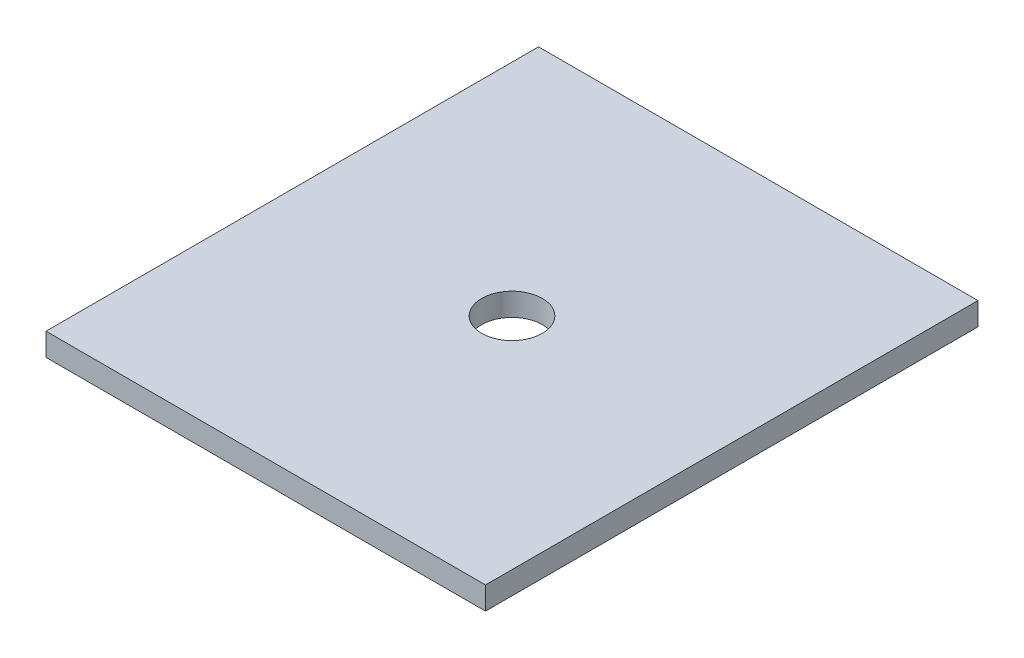
ISO-10303-21;
HEADER;
FILE_DESCRIPTION(('STEP AP214'),'2;1');
FILE_NAME('part.step','',(''),(''),'','','');
FILE_SCHEMA(('AUTOMOTIVE_DESIGN { 1 0 10303 214 1 1 1 1 }'));
ENDSEC;
DATA;
#1=APPLICATION_CONTEXT('core data for automotive mechanical design processes');
#2=APPLICATION_PROTOCOL_DEFINITION('international standard','automotive_design',2000,#1);
#3=PRODUCT_CONTEXT('',#1,'mechanical');
#4=PRODUCT('Part','Part','',(#3));
#5=PRODUCT_RELATED_PRODUCT_CATEGORY('part','',(#4));
#6=PRODUCT_DEFINITION_FORMATION('','',#4);
#7=PRODUCT_DEFINITION_CONTEXT('part definition',#1,'design');
#8=PRODUCT_DEFINITION('design','',#6,#7);
#9=PRODUCT_DEFINITION_SHAPE('','',#8);
#10=(LENGTH_UNIT() NAMED_UNIT(*) SI_UNIT(.MILLI.,.METRE.));
#11=(NAMED_UNIT(*) PLANE_ANGLE_UNIT() SI_UNIT($,.RADIAN.));
#12=(NAMED_UNIT(*) SI_UNIT($,.STERADIAN.) SOLID_ANGLE_UNIT());
#13=UNCERTAINTY_MEASURE_WITH_UNIT(LENGTH_MEASURE(1.E-05),#10,'distance_accuracy_value','');
#14=(GEOMETRIC_REPRESENTATION_CONTEXT(3) GLOBAL_UNCERTAINTY_ASSIGNED_CONTEXT((#13)) GLOBAL_UNIT_ASSIGNED_CONTEXT((#10,
#11,#12)) REPRESENTATION_CONTEXT('',''));
#15=CARTESIAN_POINT('',(0.,0.,0.));
#16=DIRECTION('',(0.,0.,1.));
#17=DIRECTION('',(1.,0.,0.));
#18=AXIS2_PLACEMENT_3D('',#15,#16,#17);
#19=CARTESIAN_POINT('',(0.,3.,0.));
#20=DIRECTION('',(0.,-1.,0.));
#21=DIRECTION('',(0.,0.,-1.));
#22=AXIS2_PLACEMENT_3D('',#19,#20,#21);
#23=PLANE('',#22);
#24=DIRECTION('',(0.,0.,-1.));
#25=VECTOR('',#24,1.);
#26=CARTESIAN_POINT('',(28.9999561114016,3.,-32.5));
#27=LINE('',#26,#25);
#28=CARTESIAN_POINT('',(28.9999561114016,3.,32.4999508145017));
#29=VERTEX_POINT('',#28);
#30=CARTESIAN_POINT('',(28.9999561114016,3.,-32.5));
#31=VERTEX_POINT('',#30);
#32=EDGE_CURVE('E92',#29,#31,#27,.T.);
#33=ORIENTED_EDGE('',*,*,#32,.T.);
#34=DIRECTION('',(-1.,0.,0.));
#35=VECTOR('',#34,1.);
#36=CARTESIAN_POINT('',(-29.,3.,-32.5));
#37=LINE('',#36,#35);
#38=CARTESIAN_POINT('',(-29.,3.,-32.5));
#39=VERTEX_POINT('',#38);
#40=EDGE_CURVE('E87',#31,#39,#37,.T.);
#41=ORIENTED_EDGE('',*,*,#40,.T.);
#42=DIRECTION('',(0.,0.,1.));
#43=VECTOR('',#42,1.);
#44=CARTESIAN_POINT('',(-29.,3.,32.4999508145017));
#45=LINE('',#44,#43);
#46=CARTESIAN_POINT('',(-29.,3.,32.4999508145017));
#47=VERTEX_POINT('',#46);
#48=EDGE_CURVE('E90',#39,#47,#45,.T.);
#49=ORIENTED_EDGE('',*,*,#48,.T.);
#50=DIRECTION('',(1.,0.,0.));
#51=VECTOR('',#50,1.);
#52=CARTESIAN_POINT('',(28.9999561114016,3.,32.4999508145017));
#53=LINE('',#52,#51);
#54=EDGE_CURVE('E57',#47,#29,#53,.T.);
#55=ORIENTED_EDGE('',*,*,#54,.T.);
#56=EDGE_LOOP('',(#33,#41,#49,#55));
#57=FACE_BOUND('',#56,.T.);
#58=CARTESIAN_POINT('',(0.,3.,0.));
#59=DIRECTION('',(0.,1.,0.));
#60=DIRECTION('',(0.,0.,1.));
#61=AXIS2_PLACEMENT_3D('',#58,#59,#60);
#62=CIRCLE('',#61,4.00000000000003);
#63=CARTESIAN_POINT('',(0.,3.,4.00000000000003));
#64=VERTEX_POINT('',#63);
#65=EDGE_CURVE('E107',#64,#64,#62,.T.);
#66=ORIENTED_EDGE('',*,*,#65,.F.);
#67=EDGE_LOOP('',(#66));
#68=FACE_BOUND('',#67,.T.);
#69=ADVANCED_FACE('F40',(#57,#68),#23,.F.);
#70=CARTESIAN_POINT('',(0.,0.,0.));
#71=DIRECTION('',(0.,-1.,0.));
#72=DIRECTION('',(0.,0.,-1.));
#73=AXIS2_PLACEMENT_3D('',#70,#71,#72);
#74=PLANE('',#73);
#75=DIRECTION('',(0.,0.,-1.));
#76=VECTOR('',#75,1.);
#77=CARTESIAN_POINT('',(28.9999561114016,0.,-32.5));
#78=LINE('',#77,#76);
#79=CARTESIAN_POINT('',(28.9999561114016,0.,32.4999508145017));
#80=VERTEX_POINT('',#79);
#81=CARTESIAN_POINT('',(28.9999561114016,0.,-32.5));
#82=VERTEX_POINT('',#81);
#83=EDGE_CURVE('E104',#80,#82,#78,.T.);
#84=ORIENTED_EDGE('',*,*,#83,.F.);
#85=DIRECTION('',(1.,0.,0.));
#86=VECTOR('',#85,1.);
#87=CARTESIAN_POINT('',(28.9999561114016,0.,32.4999508145017));
#88=LINE('',#87,#86);
#89=CARTESIAN_POINT('',(-29.,0.,32.4999508145017));
#90=VERTEX_POINT('',#89);
#91=EDGE_CURVE('E80',#90,#80,#88,.T.);
#92=ORIENTED_EDGE('',*,*,#91,.F.);
#93=DIRECTION('',(0.,0.,1.));
#94=VECTOR('',#93,1.);
#95=CARTESIAN_POINT('',(-29.,0.,32.4999508145017));
#96=LINE('',#95,#94);
#97=CARTESIAN_POINT('',(-29.,0.,-32.5));
#98=VERTEX_POINT('',#97);
#99=EDGE_CURVE('E74',#98,#90,#96,.T.);
#100=ORIENTED_EDGE('',*,*,#99,.F.);
#101=DIRECTION('',(-1.,0.,0.));
#102=VECTOR('',#101,1.);
#103=CARTESIAN_POINT('',(-29.,0.,-32.5));
#104=LINE('',#103,#102);
#105=EDGE_CURVE('E96',#82,#98,#104,.T.);
#106=ORIENTED_EDGE('',*,*,#105,.F.);
#107=EDGE_LOOP('',(#84,#92,#100,#106));
#108=FACE_BOUND('',#107,.T.);
#109=CARTESIAN_POINT('',(0.,0.,0.));
#110=DIRECTION('',(0.,1.,0.));
#111=DIRECTION('',(0.,0.,1.));
#112=AXIS2_PLACEMENT_3D('',#109,#110,#111);
#113=CIRCLE('',#112,4.00000000000003);
#114=CARTESIAN_POINT('',(0.,0.,4.00000000000003));
#115=VERTEX_POINT('',#114);
#116=EDGE_CURVE('E119',#115,#115,#113,.T.);
#117=ORIENTED_EDGE('',*,*,#116,.T.);
#118=EDGE_LOOP('',(#117));
#119=FACE_BOUND('',#118,.T.);
#120=ADVANCED_FACE('F115',(#108,#119),#74,.T.);
#121=CARTESIAN_POINT('',(28.9999561114016,3.,-32.5));
#122=DIRECTION('',(-1.,0.,0.));
#123=DIRECTION('',(0.,0.,1.));
#124=AXIS2_PLACEMENT_3D('',#121,#122,#123);
#125=PLANE('',#124);
#126=ORIENTED_EDGE('',*,*,#83,.T.);
#127=DIRECTION('',(0.,-1.,0.));
#128=VECTOR('',#127,1.);
#129=CARTESIAN_POINT('',(28.9999561114016,3.,-32.5));
#130=LINE('',#129,#128);
#131=EDGE_CURVE('E11',#31,#82,#130,.T.);
#132=ORIENTED_EDGE('',*,*,#131,.F.);
#133=ORIENTED_EDGE('',*,*,#32,.F.);
#134=DIRECTION('',(0.,-1.,0.));
#135=VECTOR('',#134,1.);
#136=CARTESIAN_POINT('',(28.9999561114016,3.,32.4999508145017));
#137=LINE('',#136,#135);
#138=EDGE_CURVE('E100',#29,#80,#137,.T.);
#139=ORIENTED_EDGE('',*,*,#138,.T.);
#140=EDGE_LOOP('',(#126,#132,#133,#139));
#141=FACE_BOUND('',#140,.T.);
#142=ADVANCED_FACE('F42',(#141),#125,.F.);
#143=CARTESIAN_POINT('',(-29.,3.,-32.5));
#144=DIRECTION('',(0.,0.,1.));
#145=DIRECTION('',(1.,0.,0.));
#146=AXIS2_PLACEMENT_3D('',#143,#144,#145);
#147=PLANE('',#146);
#148=ORIENTED_EDGE('',*,*,#105,.T.);
#149=DIRECTION('',(0.,-1.,0.));
#150=VECTOR('',#149,1.);
#151=CARTESIAN_POINT('',(-29.,3.,-32.5));
#152=LINE('',#151,#150);
#153=EDGE_CURVE('E49',#39,#98,#152,.T.);
#154=ORIENTED_EDGE('',*,*,#153,.F.);
#155=ORIENTED_EDGE('',*,*,#40,.F.);
#156=ORIENTED_EDGE('',*,*,#131,.T.);
#157=EDGE_LOOP('',(#148,#154,#155,#156));
#158=FACE_BOUND('',#157,.T.);
#159=ADVANCED_FACE('F95',(#158),#147,.F.);
#160=CARTESIAN_POINT('',(-29.,3.,32.4999508145017));
#161=DIRECTION('',(1.,0.,0.));
#162=DIRECTION('',(0.,0.,-1.));
#163=AXIS2_PLACEMENT_3D('',#160,#161,#162);
#164=PLANE('',#163);
#165=ORIENTED_EDGE('',*,*,#99,.T.);
#166=DIRECTION('',(0.,-1.,0.));
#167=VECTOR('',#166,1.);
#168=CARTESIAN_POINT('',(-29.,3.,32.4999508145017));
#169=LINE('',#168,#167);
#170=EDGE_CURVE('E97',#47,#90,#169,.T.);
#171=ORIENTED_EDGE('',*,*,#170,.F.);
#172=ORIENTED_EDGE('',*,*,#48,.F.);
#173=ORIENTED_EDGE('',*,*,#153,.T.);
#174=EDGE_LOOP('',(#165,#171,#172,#173));
#175=FACE_BOUND('',#174,.T.);
#176=ADVANCED_FACE('F98',(#175),#164,.F.);
#177=CARTESIAN_POINT('',(28.9999561114016,3.,32.4999508145017));
#178=DIRECTION('',(0.,0.,-1.));
#179=DIRECTION('',(-1.,0.,0.));
#180=AXIS2_PLACEMENT_3D('',#177,#178,#179);
#181=PLANE('',#180);
#182=ORIENTED_EDGE('',*,*,#91,.T.);
#183=ORIENTED_EDGE('',*,*,#138,.F.);
#184=ORIENTED_EDGE('',*,*,#54,.F.);
#185=ORIENTED_EDGE('',*,*,#170,.T.);
#186=EDGE_LOOP('',(#182,#183,#184,#185));
#187=FACE_BOUND('',#186,.T.);
#188=ADVANCED_FACE('F112',(#187),#181,.F.);
#189=CARTESIAN_POINT('',(0.,3.,0.));
#190=DIRECTION('',(0.,-1.,0.));
#191=DIRECTION('',(0.,0.,-1.));
#192=AXIS2_PLACEMENT_3D('',#189,#190,#191);
#193=CYLINDRICAL_SURFACE('',#192,4.00000000000003);
#194=ORIENTED_EDGE('',*,*,#65,.T.);
#195=EDGE_LOOP('',(#194));
#196=FACE_BOUND('',#195,.T.);
#197=ORIENTED_EDGE('',*,*,#116,.F.);
#198=EDGE_LOOP('',(#197));
#199=FACE_BOUND('',#198,.T.);
#200=ADVANCED_FACE('F125',(#196,#199),#193,.F.);
#201=CLOSED_SHELL('',(#69,#120,#142,#159,#176,#188,#200));
#202=MANIFOLD_SOLID_BREP('B2',#201);
#203=ADVANCED_BREP_SHAPE_REPRESENTATION('',(#18,#202),#14);
#204=SHAPE_DEFINITION_REPRESENTATION(#9,#203);
ENDSEC;
END-ISO-10303-21;
